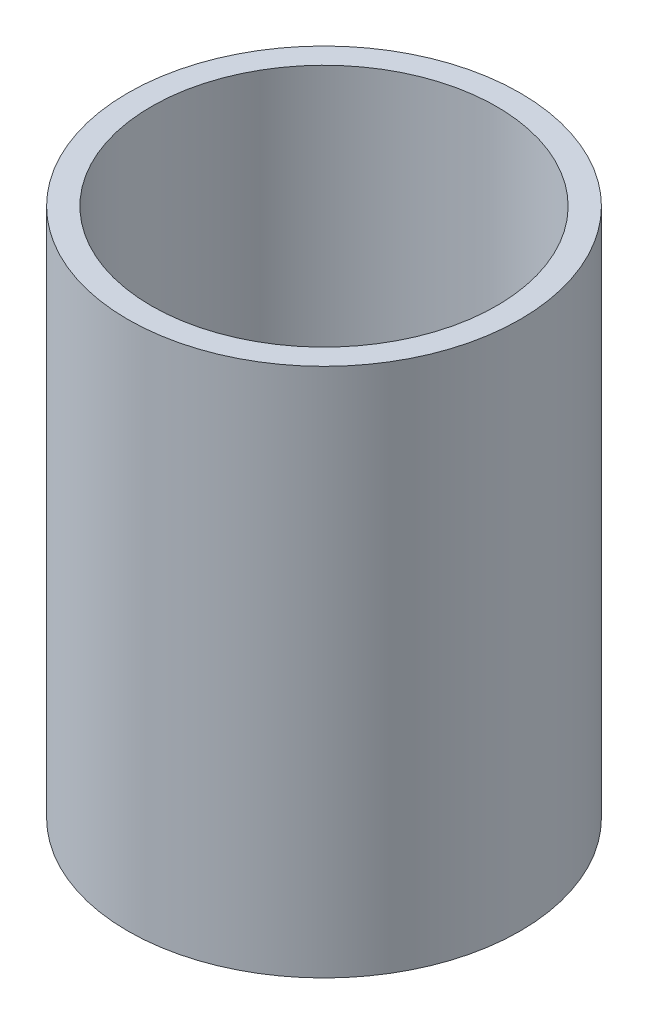
ISO-10303-21;
HEADER;
FILE_DESCRIPTION(('STEP AP214'),'2;1');
FILE_NAME('part.step','',(''),(''),'','','');
FILE_SCHEMA(('AUTOMOTIVE_DESIGN { 1 0 10303 214 1 1 1 1 }'));
ENDSEC;
DATA;
#1=APPLICATION_CONTEXT('core data for automotive mechanical design processes');
#2=APPLICATION_PROTOCOL_DEFINITION('international standard','automotive_design',2000,#1);
#3=PRODUCT_CONTEXT('',#1,'mechanical');
#4=PRODUCT('Part','Part','',(#3));
#5=PRODUCT_RELATED_PRODUCT_CATEGORY('part','',(#4));
#6=PRODUCT_DEFINITION_FORMATION('','',#4);
#7=PRODUCT_DEFINITION_CONTEXT('part definition',#1,'design');
#8=PRODUCT_DEFINITION('design','',#6,#7);
#9=PRODUCT_DEFINITION_SHAPE('','',#8);
#10=(LENGTH_UNIT() NAMED_UNIT(*) SI_UNIT(.MILLI.,.METRE.));
#11=(NAMED_UNIT(*) PLANE_ANGLE_UNIT() SI_UNIT($,.RADIAN.));
#12=(NAMED_UNIT(*) SI_UNIT($,.STERADIAN.) SOLID_ANGLE_UNIT());
#13=UNCERTAINTY_MEASURE_WITH_UNIT(LENGTH_MEASURE(1.E-05),#10,'distance_accuracy_value','');
#14=(GEOMETRIC_REPRESENTATION_CONTEXT(3) GLOBAL_UNCERTAINTY_ASSIGNED_CONTEXT((#13)) GLOBAL_UNIT_ASSIGNED_CONTEXT((#10,
#11,#12)) REPRESENTATION_CONTEXT('',''));
#15=CARTESIAN_POINT('',(0.,0.,0.));
#16=DIRECTION('',(0.,0.,1.));
#17=DIRECTION('',(1.,0.,0.));
#18=AXIS2_PLACEMENT_3D('',#15,#16,#17);
#19=CARTESIAN_POINT('',(0.,0.,0.));
#20=DIRECTION('',(0.,1.,0.));
#21=DIRECTION('',(0.,0.,1.));
#22=AXIS2_PLACEMENT_3D('',#19,#20,#21);
#23=CYLINDRICAL_SURFACE('',#22,11.176);
#24=CARTESIAN_POINT('',(0.,34.29,0.));
#25=DIRECTION('',(0.,1.,0.));
#26=DIRECTION('',(0.,0.,1.));
#27=AXIS2_PLACEMENT_3D('',#24,#25,#26);
#28=CIRCLE('',#27,11.176);
#29=CARTESIAN_POINT('',(0.,34.29,11.176));
#30=VERTEX_POINT('',#29);
#31=EDGE_CURVE('E17',#30,#30,#28,.F.);
#32=ORIENTED_EDGE('',*,*,#31,.F.);
#33=EDGE_LOOP('',(#32));
#34=FACE_BOUND('',#33,.T.);
#35=CARTESIAN_POINT('',(0.,0.,0.));
#36=DIRECTION('',(0.,1.,0.));
#37=DIRECTION('',(0.,0.,1.));
#38=AXIS2_PLACEMENT_3D('',#35,#36,#37);
#39=CIRCLE('',#38,11.176);
#40=CARTESIAN_POINT('',(0.,0.,11.176));
#41=VERTEX_POINT('',#40);
#42=EDGE_CURVE('E26',#41,#41,#39,.F.);
#43=ORIENTED_EDGE('',*,*,#42,.T.);
#44=EDGE_LOOP('',(#43));
#45=FACE_BOUND('',#44,.T.);
#46=ADVANCED_FACE('F14',(#34,#45),#23,.F.);
#47=CARTESIAN_POINT('',(0.,34.29,0.));
#48=DIRECTION('',(0.,1.,0.));
#49=DIRECTION('',(0.,0.,1.));
#50=AXIS2_PLACEMENT_3D('',#47,#48,#49);
#51=PLANE('',#50);
#52=ORIENTED_EDGE('',*,*,#31,.T.);
#53=EDGE_LOOP('',(#52));
#54=FACE_BOUND('',#53,.T.);
#55=CARTESIAN_POINT('',(0.,34.29,0.));
#56=DIRECTION('',(0.,1.,0.));
#57=DIRECTION('',(0.,0.,1.));
#58=AXIS2_PLACEMENT_3D('',#55,#56,#57);
#59=CIRCLE('',#58,12.7);
#60=CARTESIAN_POINT('',(0.,34.29,12.7));
#61=VERTEX_POINT('',#60);
#62=EDGE_CURVE('E21',#61,#61,#59,.F.);
#63=ORIENTED_EDGE('',*,*,#62,.F.);
#64=EDGE_LOOP('',(#63));
#65=FACE_BOUND('',#64,.T.);
#66=ADVANCED_FACE('F34',(#54,#65),#51,.T.);
#67=CARTESIAN_POINT('',(0.,0.,0.));
#68=DIRECTION('',(0.,1.,0.));
#69=DIRECTION('',(0.,0.,1.));
#70=AXIS2_PLACEMENT_3D('',#67,#68,#69);
#71=PLANE('',#70);
#72=ORIENTED_EDGE('',*,*,#42,.F.);
#73=EDGE_LOOP('',(#72));
#74=FACE_BOUND('',#73,.T.);
#75=CARTESIAN_POINT('',(0.,0.,0.));
#76=DIRECTION('',(0.,1.,0.));
#77=DIRECTION('',(0.,0.,1.));
#78=AXIS2_PLACEMENT_3D('',#75,#76,#77);
#79=CIRCLE('',#78,12.7);
#80=CARTESIAN_POINT('',(0.,0.,12.7));
#81=VERTEX_POINT('',#80);
#82=EDGE_CURVE('E10',#81,#81,#79,.T.);
#83=ORIENTED_EDGE('',*,*,#82,.F.);
#84=EDGE_LOOP('',(#83));
#85=FACE_BOUND('',#84,.T.);
#86=ADVANCED_FACE('F42',(#74,#85),#71,.F.);
#87=CARTESIAN_POINT('',(0.,0.,0.));
#88=DIRECTION('',(0.,1.,0.));
#89=DIRECTION('',(0.,0.,1.));
#90=AXIS2_PLACEMENT_3D('',#87,#88,#89);
#91=CYLINDRICAL_SURFACE('',#90,12.7);
#92=ORIENTED_EDGE('',*,*,#62,.T.);
#93=EDGE_LOOP('',(#92));
#94=FACE_BOUND('',#93,.T.);
#95=ORIENTED_EDGE('',*,*,#82,.T.);
#96=EDGE_LOOP('',(#95));
#97=FACE_BOUND('',#96,.T.);
#98=ADVANCED_FACE('F43',(#94,#97),#91,.T.);
#99=CLOSED_SHELL('',(#46,#66,#86,#98));
#100=MANIFOLD_SOLID_BREP('B1',#99);
#101=ADVANCED_BREP_SHAPE_REPRESENTATION('',(#18,#100),#14);
#102=SHAPE_DEFINITION_REPRESENTATION(#9,#101);
ENDSEC;
END-ISO-10303-21;
